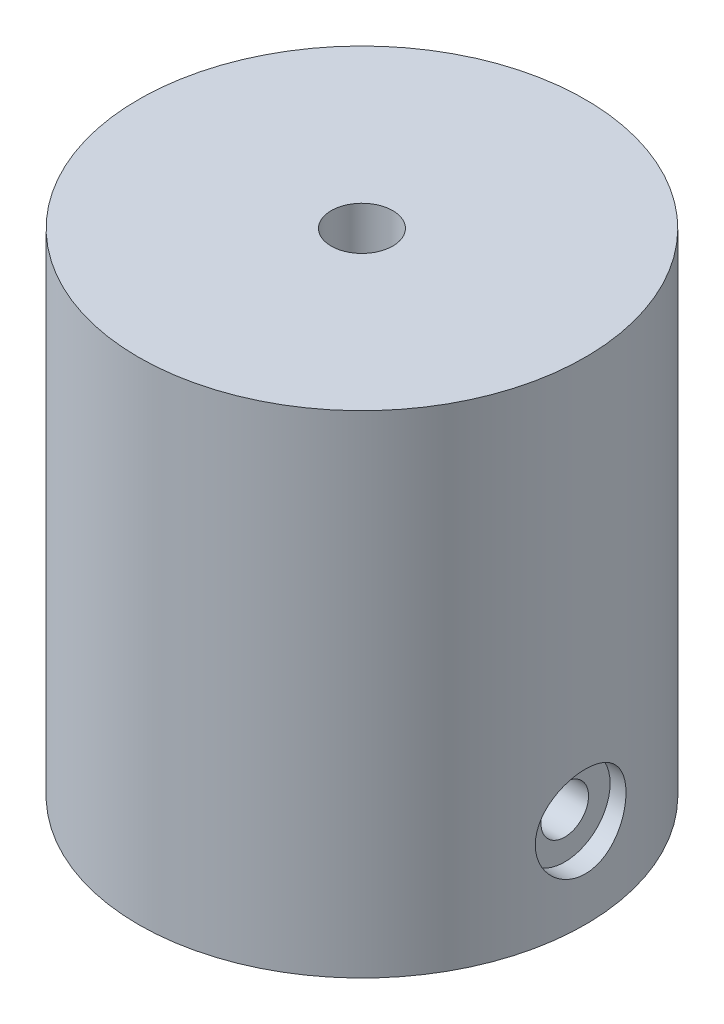
ISO-10303-21;
HEADER;
FILE_DESCRIPTION(('STEP AP214'),'2;1');
FILE_NAME('part.step','',(''),(''),'','','');
FILE_SCHEMA(('AUTOMOTIVE_DESIGN { 1 0 10303 214 1 1 1 1 }'));
ENDSEC;
DATA;
#1=APPLICATION_CONTEXT('core data for automotive mechanical design processes');
#2=APPLICATION_PROTOCOL_DEFINITION('international standard','automotive_design',2000,#1);
#3=PRODUCT_CONTEXT('',#1,'mechanical');
#4=PRODUCT('Part','Part','',(#3));
#5=PRODUCT_RELATED_PRODUCT_CATEGORY('part','',(#4));
#6=PRODUCT_DEFINITION_FORMATION('','',#4);
#7=PRODUCT_DEFINITION_CONTEXT('part definition',#1,'design');
#8=PRODUCT_DEFINITION('design','',#6,#7);
#9=PRODUCT_DEFINITION_SHAPE('','',#8);
#10=(LENGTH_UNIT() NAMED_UNIT(*) SI_UNIT(.MILLI.,.METRE.));
#11=(NAMED_UNIT(*) PLANE_ANGLE_UNIT() SI_UNIT($,.RADIAN.));
#12=(NAMED_UNIT(*) SI_UNIT($,.STERADIAN.) SOLID_ANGLE_UNIT());
#13=UNCERTAINTY_MEASURE_WITH_UNIT(LENGTH_MEASURE(1.E-05),#10,'distance_accuracy_value','');
#14=(GEOMETRIC_REPRESENTATION_CONTEXT(3) GLOBAL_UNCERTAINTY_ASSIGNED_CONTEXT((#13)) GLOBAL_UNIT_ASSIGNED_CONTEXT((#10,
#11,#12)) REPRESENTATION_CONTEXT('',''));
#15=CARTESIAN_POINT('',(0.,0.,0.));
#16=DIRECTION('',(0.,0.,1.));
#17=DIRECTION('',(1.,0.,0.));
#18=AXIS2_PLACEMENT_3D('',#15,#16,#17);
#19=CARTESIAN_POINT('',(0.,0.,0.));
#20=DIRECTION('',(0.,1.,0.));
#21=DIRECTION('',(0.,0.,1.));
#22=AXIS2_PLACEMENT_3D('',#19,#20,#21);
#23=PLANE('',#22);
#24=CARTESIAN_POINT('',(0.,0.,0.));
#25=DIRECTION('',(0.,1.,0.));
#26=DIRECTION('',(0.,0.,1.));
#27=AXIS2_PLACEMENT_3D('',#24,#25,#26);
#28=CIRCLE('',#27,1.74999999999999);
#29=CARTESIAN_POINT('',(0.,0.,1.74999999999999));
#30=VERTEX_POINT('',#29);
#31=EDGE_CURVE('E52',#30,#30,#28,.T.);
#32=ORIENTED_EDGE('',*,*,#31,.T.);
#33=EDGE_LOOP('',(#32));
#34=FACE_BOUND('',#33,.T.);
#35=CARTESIAN_POINT('',(0.,0.,0.));
#36=DIRECTION('',(0.,-1.,0.));
#37=DIRECTION('',(0.,0.,-1.));
#38=AXIS2_PLACEMENT_3D('',#35,#36,#37);
#39=CIRCLE('',#38,2.74999999999999);
#40=CARTESIAN_POINT('',(0.,0.,-2.74999999999999));
#41=VERTEX_POINT('',#40);
#42=EDGE_CURVE('E130',#41,#41,#39,.T.);
#43=ORIENTED_EDGE('',*,*,#42,.T.);
#44=EDGE_LOOP('',(#43));
#45=FACE_BOUND('',#44,.T.);
#46=ADVANCED_FACE('F31',(#34,#45),#23,.F.);
#47=CARTESIAN_POINT('',(0.,27.94,0.));
#48=DIRECTION('',(0.,-1.,0.));
#49=DIRECTION('',(0.,0.,-1.));
#50=AXIS2_PLACEMENT_3D('',#47,#48,#49);
#51=CYLINDRICAL_SURFACE('',#50,12.7);
#52=CARTESIAN_POINT('',(12.4353066067186,5.08,-2.57937));
#53=CARTESIAN_POINT('',(12.4353094688823,4.93672804622682,-2.57936475832753));
#54=CARTESIAN_POINT('',(12.4378095720739,4.79339056871941,-2.56739231651133));
#55=CARTESIAN_POINT('',(12.4475245813173,4.51077393922307,-2.51986077717828));
#56=CARTESIAN_POINT('',(12.4547432015932,4.37149807466453,-2.48428309825109));
#57=CARTESIAN_POINT('',(12.4730447361283,4.1011341969825,-2.39069265188242));
#58=CARTESIAN_POINT('',(12.4841237426792,3.97003806148826,-2.332702565132));
#59=CARTESIAN_POINT('',(12.5088930698552,3.71943815322531,-2.19599599111851));
#60=CARTESIAN_POINT('',(12.5225832595449,3.59993379965071,-2.11728054303385));
#61=CARTESIAN_POINT('',(12.5512554010689,3.37416189884906,-1.94013434907257));
#62=CARTESIAN_POINT('',(12.5662519082378,3.26808795724803,-1.84145916982624));
#63=CARTESIAN_POINT('',(12.5957189592248,3.07387899981591,-1.6277225882994));
#64=CARTESIAN_POINT('',(12.6101894654929,2.98574526263477,-1.51266001903515));
#65=CARTESIAN_POINT('',(12.6371313123354,2.82916490177023,-1.26813021541968));
#66=CARTESIAN_POINT('',(12.6495834863834,2.76090261905644,-1.1385426486483));
#67=CARTESIAN_POINT('',(12.6709219946601,2.64719290012453,-0.869441961309843));
#68=CARTESIAN_POINT('',(12.6798086731797,2.60174326096996,-0.729929800611818));
#69=CARTESIAN_POINT('',(12.6929120682326,2.53555266745193,-0.446950033769067));
#70=CARTESIAN_POINT('',(12.6971905429861,2.51448466219714,-0.303561834158032));
#71=CARTESIAN_POINT('',(12.7008088655884,2.49663464930322,-0.0152265659158909));
#72=CARTESIAN_POINT('',(12.7001492035688,2.49985023141298,0.129720346580214));
#73=CARTESIAN_POINT('',(12.6940133289644,2.53022877263884,0.414810033373953));
#74=CARTESIAN_POINT('',(12.688607981929,2.55703940962111,0.554992097874482));
#75=CARTESIAN_POINT('',(12.6736681321257,2.63328775708362,0.828825201426019));
#76=CARTESIAN_POINT('',(12.6641334605323,2.68272639270377,0.962475973199511));
#77=CARTESIAN_POINT('',(12.6418899380282,2.80315138160765,1.22045340626547));
#78=CARTESIAN_POINT('',(12.6291609538838,2.87427504771425,1.3447141624029));
#79=CARTESIAN_POINT('',(12.6019308499994,3.03594942942411,1.57966720706697));
#80=CARTESIAN_POINT('',(12.5874295203843,3.12650244674677,1.69035788555603));
#81=CARTESIAN_POINT('',(12.5579478781511,3.32639555886475,1.89712028990667));
#82=CARTESIAN_POINT('',(12.5429636409608,3.43604400488078,1.99289358214547));
#83=CARTESIAN_POINT('',(12.5144516859888,3.6699977041802,2.1647424222211));
#84=CARTESIAN_POINT('',(12.5009239975069,3.79430325219881,2.24081757385564));
#85=CARTESIAN_POINT('',(12.4768486351221,4.05447974266776,2.37121824930276));
#86=CARTESIAN_POINT('',(12.4663077724792,4.19037621453776,2.42549417712222));
#87=CARTESIAN_POINT('',(12.4494984922193,4.46962373107516,2.5103541011599));
#88=CARTESIAN_POINT('',(12.4432294987798,4.61297376824132,2.5409412905556));
#89=CARTESIAN_POINT('',(12.4357894532422,4.90035087768729,2.57710677045208));
#90=CARTESIAN_POINT('',(12.4345304457616,5.0443214262691,2.58311659422301));
#91=CARTESIAN_POINT('',(12.4370166414185,5.33120775787035,2.57111909680249));
#92=CARTESIAN_POINT('',(12.4407615513362,5.47412360219997,2.55311318288642));
#93=CARTESIAN_POINT('',(12.4527511471152,5.75338490051655,2.49396774840908));
#94=CARTESIAN_POINT('',(12.4609507395398,5.88978154003965,2.45305993262327));
#95=CARTESIAN_POINT('',(12.4808860901403,6.15378497167016,2.34952016398239));
#96=CARTESIAN_POINT('',(12.4926221473258,6.28139101940759,2.28688637411828));
#97=CARTESIAN_POINT('',(12.5185049730582,6.52607596059998,2.14069994314159));
#98=CARTESIAN_POINT('',(12.5326819689506,6.64299067001138,2.05687795011293));
#99=CARTESIAN_POINT('',(12.5617668681959,6.86125226753034,1.87105249264841));
#100=CARTESIAN_POINT('',(12.5766748491179,6.96259749873077,1.76904709562288));
#101=CARTESIAN_POINT('',(12.6058281432973,7.14848565527262,1.54781065733237));
#102=CARTESIAN_POINT('',(12.6200591858592,7.23273641265994,1.42833194223983));
#103=CARTESIAN_POINT('',(12.6460047573717,7.37996900803344,1.17666572079384));
#104=CARTESIAN_POINT('',(12.6577193940844,7.44295175686472,1.04447875900809));
#105=CARTESIAN_POINT('',(12.6772514150204,7.54543764397406,0.771906372503104));
#106=CARTESIAN_POINT('',(12.685091305789,7.58507663892852,0.631573713946712));
#107=CARTESIAN_POINT('',(12.6960871522712,7.64017935686039,0.346066345677437));
#108=CARTESIAN_POINT('',(12.699243690621,7.65564608702019,0.200892240566526));
#109=CARTESIAN_POINT('',(12.7005028359671,7.6618457578811,-0.087389149867774));
#110=CARTESIAN_POINT('',(12.6986950981539,7.65301746238518,-0.230486788308877));
#111=CARTESIAN_POINT('',(12.6904178832589,7.61184848785017,-0.513113922924204));
#112=CARTESIAN_POINT('',(12.6839484685937,7.57950812362129,-0.652643466846835));
#113=CARTESIAN_POINT('',(12.6670780035694,7.49243056251369,-0.923889702027531));
#114=CARTESIAN_POINT('',(12.6566864815267,7.43774761804541,-1.05562443978375));
#115=CARTESIAN_POINT('',(12.6330891967425,7.30759339831717,-1.30811119518491));
#116=CARTESIAN_POINT('',(12.6198832032038,7.23212041804712,-1.42886231097196));
#117=CARTESIAN_POINT('',(12.5918313434935,7.0610563374571,-1.65811903549032));
#118=CARTESIAN_POINT('',(12.5769619013358,6.96515217417924,-1.76638818737242));
#119=CARTESIAN_POINT('',(12.5473969022253,6.7565894877257,-1.96544711477569));
#120=CARTESIAN_POINT('',(12.5327013873878,6.64392699276634,-2.05623273490188));
#121=CARTESIAN_POINT('',(12.5049669368737,6.40353467466227,-2.21871360020685));
#122=CARTESIAN_POINT('',(12.4919483473188,6.27565055193105,-2.29018418728964));
#123=CARTESIAN_POINT('',(12.4692913617649,6.00945799005485,-2.41050854116683));
#124=CARTESIAN_POINT('',(12.459649933807,5.87115903742737,-2.45938260741732));
#125=CARTESIAN_POINT('',(12.4467410169478,5.62381114843058,-2.52376835646429));
#126=CARTESIAN_POINT('',(12.4424799837994,5.51616258032573,-2.54458124587203));
#127=CARTESIAN_POINT('',(12.4367617358466,5.29902206154251,-2.57238381876637));
#128=CARTESIAN_POINT('',(12.4353044186191,5.18953017835014,-2.5793740072136));
#129=CARTESIAN_POINT('',(12.4353066067186,5.08,-2.57937));
#130=B_SPLINE_CURVE_WITH_KNOTS('',3,(#52,#53,#54,#55,#56,#57,#58,#59,#60,#61,#62,#63,#64,#65,
#66,#67,#68,#69,#70,#71,#72,#73,#74,#75,#76,#77,#78,#79,#80,#81,#82,#83,#84,#85,#86,#87,#88,#89,
#90,#91,#92,#93,#94,#95,#96,#97,#98,#99,#100,#101,#102,#103,#104,#105,#106,#107,#108,#109,#110,
#111,#112,#113,#114,#115,#116,#117,#118,#119,#120,#121,#122,#123,#124,#125,#126,#127,#128,#129),
.UNSPECIFIED.,.T.,.F.,(4,2,2,2,2,2,2,2,2,2,2,2,2,2,2,2,2,2,2,2,2,2,2,2,2,2,2,2,2,2,2,2,2,2,2,2,
2,2,4),(0.,0.42941476138426,0.859167948242504,1.28848737158144,1.71778527276056,
2.15269898418159,2.58764368230853,3.02650325309362,3.46532043660214,3.8981805649995,
4.33099773072108,4.75745967010286,5.18393904682912,5.61317710535161,6.04246604213446,
6.47946899434203,6.91648073560889,7.35448117714481,7.79242256713223,8.22264060912855,
8.65283344229417,9.07875056750447,9.50470371431713,9.93637096154688,10.3680841151205,
10.806648359429,11.2451938189617,11.6811611295994,12.1170741988318,12.5451666723125,
12.9732534140389,13.4003067924032,13.8273952042426,14.2615708467135,14.6958495547824,
15.1349810352329,15.5737172542153,15.9020131450921,16.2302970426863),.UNSPECIFIED.);
#131=CARTESIAN_POINT('',(12.4353066067186,5.08,-2.57937));
#132=VERTEX_POINT('',#131);
#133=EDGE_CURVE('E10',#132,#132,#130,.T.);
#134=ORIENTED_EDGE('',*,*,#133,.T.);
#135=EDGE_LOOP('',(#134));
#136=FACE_BOUND('',#135,.T.);
#137=CARTESIAN_POINT('',(0.,27.94,0.));
#138=DIRECTION('',(0.,1.,0.));
#139=DIRECTION('',(0.,0.,1.));
#140=AXIS2_PLACEMENT_3D('',#137,#138,#139);
#141=CIRCLE('',#140,12.7);
#142=CARTESIAN_POINT('',(0.,27.94,12.7));
#143=VERTEX_POINT('',#142);
#144=EDGE_CURVE('E43',#143,#143,#141,.T.);
#145=ORIENTED_EDGE('',*,*,#144,.F.);
#146=EDGE_LOOP('',(#145));
#147=FACE_BOUND('',#146,.T.);
#148=CARTESIAN_POINT('',(0.,0.,0.));
#149=DIRECTION('',(0.,1.,0.));
#150=DIRECTION('',(0.,0.,1.));
#151=AXIS2_PLACEMENT_3D('',#148,#149,#150);
#152=CIRCLE('',#151,12.7);
#153=CARTESIAN_POINT('',(0.,0.,12.7));
#154=VERTEX_POINT('',#153);
#155=EDGE_CURVE('E47',#154,#154,#152,.T.);
#156=ORIENTED_EDGE('',*,*,#155,.T.);
#157=EDGE_LOOP('',(#156));
#158=FACE_BOUND('',#157,.T.);
#159=ADVANCED_FACE('F33',(#136,#147,#158),#51,.T.);
#160=CARTESIAN_POINT('',(0.,27.94,0.));
#161=DIRECTION('',(0.,1.,0.));
#162=DIRECTION('',(0.,0.,1.));
#163=AXIS2_PLACEMENT_3D('',#160,#161,#162);
#164=PLANE('',#163);
#165=CARTESIAN_POINT('',(0.,27.94,0.));
#166=DIRECTION('',(0.,1.,0.));
#167=DIRECTION('',(0.,0.,1.));
#168=AXIS2_PLACEMENT_3D('',#165,#166,#167);
#169=CIRCLE('',#168,1.75);
#170=CARTESIAN_POINT('',(0.,27.94,1.75));
#171=VERTEX_POINT('',#170);
#172=EDGE_CURVE('E56',#171,#171,#169,.T.);
#173=ORIENTED_EDGE('',*,*,#172,.F.);
#174=EDGE_LOOP('',(#173));
#175=FACE_BOUND('',#174,.T.);
#176=ORIENTED_EDGE('',*,*,#144,.T.);
#177=EDGE_LOOP('',(#176));
#178=FACE_BOUND('',#177,.T.);
#179=ADVANCED_FACE('F106',(#175,#178),#164,.T.);
#180=CARTESIAN_POINT('',(0.,0.,0.));
#181=DIRECTION('',(0.,-1.,0.));
#182=DIRECTION('',(0.,0.,-1.));
#183=AXIS2_PLACEMENT_3D('',#180,#181,#182);
#184=CIRCLE('',#183,11.2);
#185=CARTESIAN_POINT('',(0.,0.,-11.2));
#186=VERTEX_POINT('',#185);
#187=EDGE_CURVE('E120',#186,#186,#184,.T.);
#188=ORIENTED_EDGE('',*,*,#187,.F.);
#189=EDGE_LOOP('',(#188));
#190=FACE_BOUND('',#189,.T.);
#191=ORIENTED_EDGE('',*,*,#155,.F.);
#192=EDGE_LOOP('',(#191));
#193=FACE_BOUND('',#192,.T.);
#194=ADVANCED_FACE('F102',(#190,#193),#23,.F.);
#195=CARTESIAN_POINT('',(0.,27.94,0.));
#196=DIRECTION('',(0.,1.,0.));
#197=DIRECTION('',(0.,0.,1.));
#198=AXIS2_PLACEMENT_3D('',#195,#196,#197);
#199=CYLINDRICAL_SURFACE('',#198,1.75);
#200=CARTESIAN_POINT('',(1.11045418523233,5.08,-1.35255));
#201=CARTESIAN_POINT('',(1.11046060423106,5.14224954026333,-1.35254702774497));
#202=CARTESIAN_POINT('',(1.11581652157482,5.20451280543939,-1.3481992065702));
#203=CARTESIAN_POINT('',(1.13586354725032,5.32647169118882,-1.33134119057651));
#204=CARTESIAN_POINT('',(1.15059086976145,5.38615638758091,-1.31879932624303));
#205=CARTESIAN_POINT('',(1.19034750517078,5.51391638868576,-1.28312885961846));
#206=CARTESIAN_POINT('',(1.21691696939926,5.58101037876484,-1.25829599785967));
#207=CARTESIAN_POINT('',(1.27484423676586,5.70878603549583,-1.19957423909776));
#208=CARTESIAN_POINT('',(1.30620788169395,5.76945972416458,-1.16567425534833));
#209=CARTESIAN_POINT('',(1.37123027474998,5.88594730692708,-1.0885056120974));
#210=CARTESIAN_POINT('',(1.40492771772849,5.94159107644435,-1.04501368020652));
#211=CARTESIAN_POINT('',(1.47114164387515,6.04579530559269,-0.949535148437209));
#212=CARTESIAN_POINT('',(1.50365898398833,6.09436098560981,-0.897554869685833));
#213=CARTESIAN_POINT('',(1.56386249939767,6.18159187372294,-0.787769924016139));
#214=CARTESIAN_POINT('',(1.59169798485447,6.22059780200331,-0.730320545873257));
#215=CARTESIAN_POINT('',(1.64217482569287,6.29004027446957,-0.60836039816721));
#216=CARTESIAN_POINT('',(1.66482109379626,6.32048493001819,-0.543856393543552));
#217=CARTESIAN_POINT('',(1.70008795407075,6.36739678212949,-0.41921124024959));
#218=CARTESIAN_POINT('',(1.71370783087584,6.38528305709009,-0.359890483406196));
#219=CARTESIAN_POINT('',(1.73479209612193,6.41284464167488,-0.238313716264407));
#220=CARTESIAN_POINT('',(1.74226044734821,6.42252523747803,-0.176059622981295));
#221=CARTESIAN_POINT('',(1.7504202453553,6.43309796181546,-0.0501738921781692));
#222=CARTESIAN_POINT('',(1.751092017869,6.43396457628276,0.0134612104661559));
#223=CARTESIAN_POINT('',(1.74554543740328,6.42678337632117,0.139922318266619));
#224=CARTESIAN_POINT('',(1.73932609101139,6.41873427661747,0.202748205446618));
#225=CARTESIAN_POINT('',(1.72095666324401,6.3947771604829,0.323036972116206));
#226=CARTESIAN_POINT('',(1.70907655801803,6.37922652961479,0.38061425657653));
#227=CARTESIAN_POINT('',(1.68036928628465,6.3412244348321,0.492115295091951));
#228=CARTESIAN_POINT('',(1.66354097474131,6.31877137361106,0.546038199950357));
#229=CARTESIAN_POINT('',(1.62399292761551,6.26516110911442,0.654858976451268));
#230=CARTESIAN_POINT('',(1.60084123570591,6.23333939458025,0.709269568717012));
#231=CARTESIAN_POINT('',(1.55118449709065,6.16336179914487,0.812155351602899));
#232=CARTESIAN_POINT('',(1.52467701301634,6.12520130793165,0.860626177200501));
#233=CARTESIAN_POINT('',(1.46418878704378,6.03503009373196,0.960580881583774));
#234=CARTESIAN_POINT('',(1.4297816290706,5.98177949095444,1.01068757135212));
#235=CARTESIAN_POINT('',(1.36084384669277,5.86794136610278,1.10175401274467));
#236=CARTESIAN_POINT('',(1.32631314486528,5.80734793717856,1.1427063238954));
#237=CARTESIAN_POINT('',(1.26592837302221,5.68957576003755,1.20896289765853));
#238=CARTESIAN_POINT('',(1.23958177950642,5.63347726322482,1.23573338538862));
#239=CARTESIAN_POINT('',(1.19189915080728,5.51630331532004,1.28178533076172));
#240=CARTESIAN_POINT('',(1.17055194331914,5.4552393805076,1.30108355128913));
#241=CARTESIAN_POINT('',(1.14043324425781,5.34385099943918,1.32748519336273));
#242=CARTESIAN_POINT('',(1.12987479464778,5.29445359374914,1.33640176037064));
#243=CARTESIAN_POINT('',(1.11519892360246,5.19406133363913,1.34867626141698));
#244=CARTESIAN_POINT('',(1.11107060279331,5.14306933216711,1.35204360222114));
#245=CARTESIAN_POINT('',(1.10996623835868,5.04081934232885,1.35295091791385));
#246=CARTESIAN_POINT('',(1.11300858728473,4.98956100718234,1.35047590732257));
#247=CARTESIAN_POINT('',(1.12573014821927,4.88845108852518,1.33988630979825));
#248=CARTESIAN_POINT('',(1.13541950953499,4.83860177781376,1.33176309838333));
#249=CARTESIAN_POINT('',(1.16401408213478,4.72540744624909,1.30691648537601));
#250=CARTESIAN_POINT('',(1.18490057527808,4.66300489893838,1.28824511530745));
#251=CARTESIAN_POINT('',(1.23213956932324,4.54323979304819,1.2431412517856));
#252=CARTESIAN_POINT('',(1.25850830799062,4.48589294416337,1.21668560330179));
#253=CARTESIAN_POINT('',(1.32328334453258,4.35748833901436,1.14647839922958));
#254=CARTESIAN_POINT('',(1.36271321798341,4.28848745096692,1.09990726381893));
#255=CARTESIAN_POINT('',(1.44116306266401,4.15999619451184,0.9949143968667));
#256=CARTESIAN_POINT('',(1.48018323597184,4.10050090976199,0.936498827028855));
#257=CARTESIAN_POINT('',(1.54773920211093,4.00136159570764,0.819018270335713));
#258=CARTESIAN_POINT('',(1.57693209215568,3.96006197917331,0.761733760970266));
#259=CARTESIAN_POINT('',(1.63024619966466,3.88616218833795,0.639696742389234));
#260=CARTESIAN_POINT('',(1.65437536241157,3.8535483635568,0.574956183171893));
#261=CARTESIAN_POINT('',(1.69217666442944,3.80305673686392,0.450090097829708));
#262=CARTESIAN_POINT('',(1.70690816279304,3.78364987853187,0.390907166843708));
#263=CARTESIAN_POINT('',(1.7302631836146,3.75304821864966,0.269284581903353));
#264=CARTESIAN_POINT('',(1.73889002110777,3.7418489599801,0.20684671529759));
#265=CARTESIAN_POINT('',(1.74931760708422,3.72832605139161,0.080220481275673));
#266=CARTESIAN_POINT('',(1.75109500516144,3.72603276258588,0.0160268758565653));
#267=CARTESIAN_POINT('',(1.74759324632826,3.73056466083176,-0.111841900656214));
#268=CARTESIAN_POINT('',(1.74231378120579,3.7373902461548,-0.175517048983805));
#269=CARTESIAN_POINT('',(1.72564535547791,3.75909574960575,-0.296997784734779));
#270=CARTESIAN_POINT('',(1.71460186437664,3.77352061736494,-0.354934627272488));
#271=CARTESIAN_POINT('',(1.68744090638328,3.8093761592569,-0.467321408067815));
#272=CARTESIAN_POINT('',(1.67132225018084,3.83080847555513,-0.521770525411675));
#273=CARTESIAN_POINT('',(1.63330763610714,3.88212240324982,-0.631246575943978));
#274=CARTESIAN_POINT('',(1.61101161381591,3.91260794343246,-0.685848737018347));
#275=CARTESIAN_POINT('',(1.56293397384458,3.97990520913466,-0.789301904011333));
#276=CARTESIAN_POINT('',(1.53715012699433,4.01672098460504,-0.838149194160257));
#277=CARTESIAN_POINT('',(1.47815417628692,4.10375403671922,-0.938941151175121));
#278=CARTESIAN_POINT('',(1.44448411601107,4.15518062149617,-0.989572413073147));
#279=CARTESIAN_POINT('',(1.37661930065981,4.26522444973874,-1.08199112865999));
#280=CARTESIAN_POINT('',(1.34242409111405,4.32384826890856,-1.12377039837275));
#281=CARTESIAN_POINT('',(1.28052421367703,4.44063643285033,-1.19359392203676));
#282=CARTESIAN_POINT('',(1.25253184243455,4.49802175501322,-1.22268199406884));
#283=CARTESIAN_POINT('',(1.20142070172169,4.61821144480532,-1.2729375515945));
#284=CARTESIAN_POINT('',(1.1782940187585,4.68100677545984,-1.29411794219036));
#285=CARTESIAN_POINT('',(1.1441995117997,4.79952129081363,-1.32428638889606));
#286=CARTESIAN_POINT('',(1.13177689034009,4.85441409160179,-1.33480140766145));
#287=CARTESIAN_POINT('',(1.11491253527813,4.96620484774586,-1.34892484195107));
#288=CARTESIAN_POINT('',(1.11044831752188,5.02309668954711,-1.35255271698634));
#289=CARTESIAN_POINT('',(1.11045418523233,5.08,-1.35255));
#290=B_SPLINE_CURVE_WITH_KNOTS('',3,(#200,#201,#202,#203,#204,#205,#206,#207,#208,#209,#210,
#211,#212,#213,#214,#215,#216,#217,#218,#219,#220,#221,#222,#223,#224,#225,#226,#227,#228,#229,
#230,#231,#232,#233,#234,#235,#236,#237,#238,#239,#240,#241,#242,#243,#244,#245,#246,#247,#248,
#249,#250,#251,#252,#253,#254,#255,#256,#257,#258,#259,#260,#261,#262,#263,#264,#265,#266,#267,
#268,#269,#270,#271,#272,#273,#274,#275,#276,#277,#278,#279,#280,#281,#282,#283,#284,#285,#286,
#287,#288,#289),.UNSPECIFIED.,.T.,.F.,(4,2,2,2,2,2,2,2,2,2,2,2,2,2,2,2,2,2,2,2,2,2,2,2,2,2,2,2,
2,2,2,2,2,2,2,2,2,2,2,2,2,2,2,2,4),(0.,0.186447117122025,0.373619139026261,0.601317392371609,
0.829295344798103,1.06327887176304,1.29708894319286,1.52064778276738,1.74399409274169,
1.93349089881438,2.12286553620721,2.31278820593088,2.50273825816005,2.68441900807201,
2.86614183281118,3.06686019573136,3.26772518930554,3.50926202585878,3.75099447004543,
3.95292839188059,4.1544066444011,4.30766891583841,4.46067111662592,4.61406619035809,
4.76769600550384,4.97176498161452,5.17644722388864,5.45143846319326,5.72628701209103,
5.95465491423518,6.18266176958153,6.37385470418378,6.56494373478232,6.75668363316944,
6.94843190616684,7.1298211270484,7.31125288621831,7.509701135941,7.70827682431554,
7.94631291175313,8.18456812072369,8.39440873127782,8.60390537550668,8.77482334636325,
8.94525766834798),.UNSPECIFIED.);
#291=CARTESIAN_POINT('',(1.11045418523233,5.08,-1.35255));
#292=VERTEX_POINT('',#291);
#293=EDGE_CURVE('E59',#292,#292,#290,.T.);
#294=ORIENTED_EDGE('',*,*,#293,.T.);
#295=EDGE_LOOP('',(#294));
#296=FACE_BOUND('',#295,.T.);
#297=ORIENTED_EDGE('',*,*,#31,.F.);
#298=EDGE_LOOP('',(#297));
#299=FACE_BOUND('',#298,.T.);
#300=ORIENTED_EDGE('',*,*,#172,.T.);
#301=EDGE_LOOP('',(#300));
#302=FACE_BOUND('',#301,.T.);
#303=ADVANCED_FACE('F84',(#296,#299,#302),#199,.F.);
#304=CARTESIAN_POINT('',(12.7,5.08,0.));
#305=DIRECTION('',(1.,0.,0.));
#306=DIRECTION('',(0.,0.,-1.));
#307=AXIS2_PLACEMENT_3D('',#304,#305,#306);
#308=CYLINDRICAL_SURFACE('',#307,2.57937);
#309=CARTESIAN_POINT('',(11.5316,5.08,0.));
#310=DIRECTION('',(1.,0.,0.));
#311=DIRECTION('',(0.,0.,-1.));
#312=AXIS2_PLACEMENT_3D('',#309,#310,#311);
#313=CIRCLE('',#312,2.57937);
#314=CARTESIAN_POINT('',(11.5316,5.08,-2.57937));
#315=VERTEX_POINT('',#314);
#316=EDGE_CURVE('E128',#315,#315,#313,.T.);
#317=ORIENTED_EDGE('',*,*,#316,.F.);
#318=EDGE_LOOP('',(#317));
#319=FACE_BOUND('',#318,.T.);
#320=ORIENTED_EDGE('',*,*,#133,.F.);
#321=EDGE_LOOP('',(#320));
#322=FACE_BOUND('',#321,.T.);
#323=ADVANCED_FACE('F76',(#319,#322),#308,.F.);
#324=CARTESIAN_POINT('',(12.7,5.08,0.));
#325=DIRECTION('',(1.,0.,0.));
#326=DIRECTION('',(0.,0.,-1.));
#327=AXIS2_PLACEMENT_3D('',#324,#325,#326);
#328=CYLINDRICAL_SURFACE('',#327,1.35255);
#329=ORIENTED_EDGE('',*,*,#293,.F.);
#330=EDGE_LOOP('',(#329));
#331=FACE_BOUND('',#330,.T.);
#332=CARTESIAN_POINT('',(11.5316,5.08,0.));
#333=DIRECTION('',(1.,0.,0.));
#334=DIRECTION('',(0.,0.,-1.));
#335=AXIS2_PLACEMENT_3D('',#332,#333,#334);
#336=CIRCLE('',#335,1.35255);
#337=CARTESIAN_POINT('',(11.5316,5.08,-1.35255));
#338=VERTEX_POINT('',#337);
#339=EDGE_CURVE('E67',#338,#338,#336,.T.);
#340=ORIENTED_EDGE('',*,*,#339,.T.);
#341=EDGE_LOOP('',(#340));
#342=FACE_BOUND('',#341,.T.);
#343=ADVANCED_FACE('F71',(#331,#342),#328,.F.);
#344=CARTESIAN_POINT('',(11.5316,6.43255,0.));
#345=DIRECTION('',(-1.,0.,0.));
#346=DIRECTION('',(0.,0.,1.));
#347=AXIS2_PLACEMENT_3D('',#344,#345,#346);
#348=PLANE('',#347);
#349=ORIENTED_EDGE('',*,*,#339,.F.);
#350=EDGE_LOOP('',(#349));
#351=FACE_BOUND('',#350,.T.);
#352=ORIENTED_EDGE('',*,*,#316,.T.);
#353=EDGE_LOOP('',(#352));
#354=FACE_BOUND('',#353,.T.);
#355=ADVANCED_FACE('F75',(#351,#354),#348,.F.);
#356=CARTESIAN_POINT('',(0.,2.54,0.));
#357=DIRECTION('',(0.,-1.,0.));
#358=DIRECTION('',(0.,0.,-1.));
#359=AXIS2_PLACEMENT_3D('',#356,#357,#358);
#360=CYLINDRICAL_SURFACE('',#359,11.2);
#361=CARTESIAN_POINT('',(0.,2.54,0.));
#362=DIRECTION('',(0.,-1.,0.));
#363=DIRECTION('',(0.,0.,-1.));
#364=AXIS2_PLACEMENT_3D('',#361,#362,#363);
#365=CIRCLE('',#364,11.2);
#366=CARTESIAN_POINT('',(0.,2.54,-11.2));
#367=VERTEX_POINT('',#366);
#368=EDGE_CURVE('E124',#367,#367,#365,.T.);
#369=ORIENTED_EDGE('',*,*,#368,.F.);
#370=EDGE_LOOP('',(#369));
#371=FACE_BOUND('',#370,.T.);
#372=ORIENTED_EDGE('',*,*,#187,.T.);
#373=EDGE_LOOP('',(#372));
#374=FACE_BOUND('',#373,.T.);
#375=ADVANCED_FACE('F79',(#371,#374),#360,.F.);
#376=CARTESIAN_POINT('',(0.,2.54,0.));
#377=DIRECTION('',(0.,-1.,0.));
#378=DIRECTION('',(0.,0.,-1.));
#379=AXIS2_PLACEMENT_3D('',#376,#377,#378);
#380=PLANE('',#379);
#381=CARTESIAN_POINT('',(0.,2.54,0.));
#382=DIRECTION('',(0.,-1.,0.));
#383=DIRECTION('',(0.,0.,-1.));
#384=AXIS2_PLACEMENT_3D('',#381,#382,#383);
#385=CIRCLE('',#384,2.74999999999999);
#386=CARTESIAN_POINT('',(0.,2.54,-2.74999999999999));
#387=VERTEX_POINT('',#386);
#388=EDGE_CURVE('E125',#387,#387,#385,.T.);
#389=ORIENTED_EDGE('',*,*,#388,.F.);
#390=EDGE_LOOP('',(#389));
#391=FACE_BOUND('',#390,.T.);
#392=ORIENTED_EDGE('',*,*,#368,.T.);
#393=EDGE_LOOP('',(#392));
#394=FACE_BOUND('',#393,.T.);
#395=ADVANCED_FACE('F88',(#391,#394),#380,.T.);
#396=CARTESIAN_POINT('',(0.,2.54,0.));
#397=DIRECTION('',(0.,-1.,0.));
#398=DIRECTION('',(0.,0.,-1.));
#399=AXIS2_PLACEMENT_3D('',#396,#397,#398);
#400=CYLINDRICAL_SURFACE('',#399,2.74999999999999);
#401=ORIENTED_EDGE('',*,*,#388,.T.);
#402=EDGE_LOOP('',(#401));
#403=FACE_BOUND('',#402,.T.);
#404=ORIENTED_EDGE('',*,*,#42,.F.);
#405=EDGE_LOOP('',(#404));
#406=FACE_BOUND('',#405,.T.);
#407=ADVANCED_FACE('F92',(#403,#406),#400,.T.);
#408=CLOSED_SHELL('',(#46,#159,#179,#194,#303,#323,#343,#355,#375,#395,#407));
#409=MANIFOLD_SOLID_BREP('B2',#408);
#410=ADVANCED_BREP_SHAPE_REPRESENTATION('',(#18,#409),#14);
#411=SHAPE_DEFINITION_REPRESENTATION(#9,#410);
ENDSEC;
END-ISO-10303-21;
